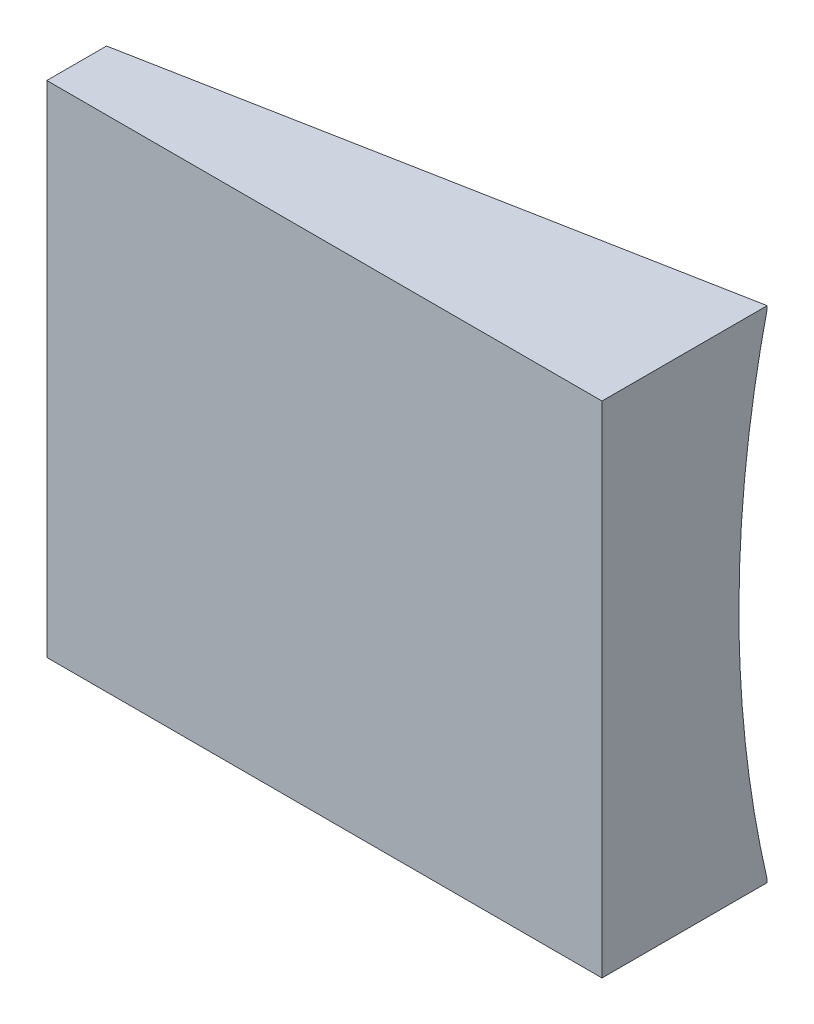
ISO-10303-21;
HEADER;
FILE_DESCRIPTION(('STEP AP214'),'2;1');
FILE_NAME('part.step','',(''),(''),'','','');
FILE_SCHEMA(('AUTOMOTIVE_DESIGN { 1 0 10303 214 1 1 1 1 }'));
ENDSEC;
DATA;
#1=APPLICATION_CONTEXT('core data for automotive mechanical design processes');
#2=APPLICATION_PROTOCOL_DEFINITION('international standard','automotive_design',2000,#1);
#3=PRODUCT_CONTEXT('',#1,'mechanical');
#4=PRODUCT('Part','Part','',(#3));
#5=PRODUCT_RELATED_PRODUCT_CATEGORY('part','',(#4));
#6=PRODUCT_DEFINITION_FORMATION('','',#4);
#7=PRODUCT_DEFINITION_CONTEXT('part definition',#1,'design');
#8=PRODUCT_DEFINITION('design','',#6,#7);
#9=PRODUCT_DEFINITION_SHAPE('','',#8);
#10=(LENGTH_UNIT() NAMED_UNIT(*) SI_UNIT(.MILLI.,.METRE.));
#11=(NAMED_UNIT(*) PLANE_ANGLE_UNIT() SI_UNIT($,.RADIAN.));
#12=(NAMED_UNIT(*) SI_UNIT($,.STERADIAN.) SOLID_ANGLE_UNIT());
#13=UNCERTAINTY_MEASURE_WITH_UNIT(LENGTH_MEASURE(1.E-05),#10,'distance_accuracy_value','');
#14=(GEOMETRIC_REPRESENTATION_CONTEXT(3) GLOBAL_UNCERTAINTY_ASSIGNED_CONTEXT((#13)) GLOBAL_UNIT_ASSIGNED_CONTEXT((#10,
#11,#12)) REPRESENTATION_CONTEXT('',''));
#15=CARTESIAN_POINT('',(0.,0.,0.));
#16=DIRECTION('',(0.,0.,1.));
#17=DIRECTION('',(1.,0.,0.));
#18=AXIS2_PLACEMENT_3D('',#15,#16,#17);
#19=CARTESIAN_POINT('',(20.0456309214071,68.9601218802256,0.0408989003201473));
#20=DIRECTION('',(0.186635756295296,0.,0.982429180385071));
#21=DIRECTION('',(0.982429180385071,0.,-0.186635756295296));
#22=AXIS2_PLACEMENT_3D('',#19,#20,#21);
#23=PLANE('',#22);
#24=DIRECTION('',(0.,1.,0.));
#25=VECTOR('',#24,1.);
#26=CARTESIAN_POINT('',(20.,-6.,0.0495675776124088));
#27=LINE('',#26,#25);
#28=CARTESIAN_POINT('',(20.,11.9,0.0495675776124097));
#29=VERTEX_POINT('',#28);
#30=CARTESIAN_POINT('',(20.,12.,0.0495675776124083));
#31=VERTEX_POINT('',#30);
#32=EDGE_CURVE('E99',#29,#31,#27,.T.);
#33=ORIENTED_EDGE('',*,*,#32,.F.);
#34=DIRECTION('',(-0.982429180385071,0.,0.186635756295296));
#35=VECTOR('',#34,1.);
#36=CARTESIAN_POINT('',(20.0456309214071,11.9,0.0408989003201482));
#37=LINE('',#36,#35);
#38=CARTESIAN_POINT('',(0.,11.9,3.84904259365668));
#39=VERTEX_POINT('',#38);
#40=EDGE_CURVE('E106',#29,#39,#37,.T.);
#41=ORIENTED_EDGE('',*,*,#40,.T.);
#42=DIRECTION('',(0.,-1.,0.));
#43=VECTOR('',#42,1.);
#44=CARTESIAN_POINT('',(0.,68.9601218802256,3.84904259365668));
#45=LINE('',#44,#43);
#46=CARTESIAN_POINT('',(0.,12.,3.84904259365668));
#47=VERTEX_POINT('',#46);
#48=EDGE_CURVE('E112',#47,#39,#45,.T.);
#49=ORIENTED_EDGE('',*,*,#48,.F.);
#50=DIRECTION('',(-0.982429180385071,0.,0.186635756295296));
#51=VECTOR('',#50,1.);
#52=CARTESIAN_POINT('',(-0.394391834731611,12.,3.92396668978641));
#53=LINE('',#52,#51);
#54=EDGE_CURVE('E109',#31,#47,#53,.T.);
#55=ORIENTED_EDGE('',*,*,#54,.F.);
#56=EDGE_LOOP('',(#33,#41,#49,#55));
#57=FACE_BOUND('',#56,.T.);
#58=ADVANCED_FACE('F33',(#57),#23,.F.);
#59=CARTESIAN_POINT('',(0.,-6.,6.));
#60=DIRECTION('',(1.,0.,0.));
#61=DIRECTION('',(0.,0.,-1.));
#62=AXIS2_PLACEMENT_3D('',#59,#60,#61);
#63=PLANE('',#62);
#64=ORIENTED_EDGE('',*,*,#48,.T.);
#65=CARTESIAN_POINT('',(0.,3.01180558268443,-35.8484753329929));
#66=DIRECTION('',(1.,0.,0.));
#67=DIRECTION('',(0.,0.,-1.));
#68=AXIS2_PLACEMENT_3D('',#65,#66,#67);
#69=ELLIPSE('',#68,40.7154030016919,40.);
#70=CARTESIAN_POINT('',(0.,3.01180558268443,4.86692766869898));
#71=VERTEX_POINT('',#70);
#72=EDGE_CURVE('E102',#39,#71,#69,.T.);
#73=ORIENTED_EDGE('',*,*,#72,.T.);
#74=DIRECTION('',(0.,1.,0.));
#75=VECTOR('',#74,1.);
#76=CARTESIAN_POINT('',(0.,-6.,4.86692766869898));
#77=LINE('',#76,#75);
#78=CARTESIAN_POINT('',(0.,2.98819441731563,4.86692766869898));
#79=VERTEX_POINT('',#78);
#80=EDGE_CURVE('E134',#79,#71,#77,.T.);
#81=ORIENTED_EDGE('',*,*,#80,.F.);
#82=CARTESIAN_POINT('',(0.,2.98819441731563,-35.8484753329929));
#83=DIRECTION('',(1.,0.,0.));
#84=DIRECTION('',(0.,0.,1.));
#85=AXIS2_PLACEMENT_3D('',#82,#83,#84);
#86=ELLIPSE('',#85,40.7154030016919,40.);
#87=CARTESIAN_POINT('',(0.,-5.89999999999996,3.84904259365668));
#88=VERTEX_POINT('',#87);
#89=EDGE_CURVE('E41',#79,#88,#86,.T.);
#90=ORIENTED_EDGE('',*,*,#89,.T.);
#91=CARTESIAN_POINT('',(0.,-5.99999999999996,3.84904259365668));
#92=VERTEX_POINT('',#91);
#93=EDGE_CURVE('E131',#88,#92,#45,.T.);
#94=ORIENTED_EDGE('',*,*,#93,.T.);
#95=DIRECTION('',(0.,0.,-1.));
#96=VECTOR('',#95,1.);
#97=CARTESIAN_POINT('',(0.,-6.,6.));
#98=LINE('',#97,#96);
#99=CARTESIAN_POINT('',(0.,-6.,6.));
#100=VERTEX_POINT('',#99);
#101=EDGE_CURVE('E119',#100,#92,#98,.T.);
#102=ORIENTED_EDGE('',*,*,#101,.F.);
#103=DIRECTION('',(0.,-1.,0.));
#104=VECTOR('',#103,1.);
#105=CARTESIAN_POINT('',(0.,-6.,6.));
#106=LINE('',#105,#104);
#107=CARTESIAN_POINT('',(0.,12.,6.));
#108=VERTEX_POINT('',#107);
#109=EDGE_CURVE('E149',#108,#100,#106,.T.);
#110=ORIENTED_EDGE('',*,*,#109,.F.);
#111=DIRECTION('',(0.,0.,-1.));
#112=VECTOR('',#111,1.);
#113=CARTESIAN_POINT('',(0.,12.,6.));
#114=LINE('',#113,#112);
#115=EDGE_CURVE('E158',#108,#47,#114,.T.);
#116=ORIENTED_EDGE('',*,*,#115,.T.);
#117=EDGE_LOOP('',(#64,#73,#81,#90,#94,#102,#110,#116));
#118=FACE_BOUND('',#117,.T.);
#119=ADVANCED_FACE('F129',(#118),#63,.F.);
#120=CARTESIAN_POINT('',(0.,-6.,6.));
#121=DIRECTION('',(0.,1.,0.));
#122=DIRECTION('',(0.,0.,1.));
#123=AXIS2_PLACEMENT_3D('',#120,#121,#122);
#124=PLANE('',#123);
#125=ORIENTED_EDGE('',*,*,#101,.T.);
#126=DIRECTION('',(0.982429180385071,0.,-0.186635756295296));
#127=VECTOR('',#126,1.);
#128=CARTESIAN_POINT('',(-0.394391834731611,-6.,3.92396668978641));
#129=LINE('',#128,#127);
#130=CARTESIAN_POINT('',(20.,-6.,0.0495675776124088));
#131=VERTEX_POINT('',#130);
#132=EDGE_CURVE('E142',#92,#131,#129,.T.);
#133=ORIENTED_EDGE('',*,*,#132,.T.);
#134=DIRECTION('',(0.,0.,-1.));
#135=VECTOR('',#134,1.);
#136=CARTESIAN_POINT('',(20.,-6.,6.));
#137=LINE('',#136,#135);
#138=CARTESIAN_POINT('',(20.,-6.,6.));
#139=VERTEX_POINT('',#138);
#140=EDGE_CURVE('E163',#139,#131,#137,.T.);
#141=ORIENTED_EDGE('',*,*,#140,.F.);
#142=DIRECTION('',(1.,0.,0.));
#143=VECTOR('',#142,1.);
#144=CARTESIAN_POINT('',(0.,-6.,6.));
#145=LINE('',#144,#143);
#146=EDGE_CURVE('E152',#100,#139,#145,.T.);
#147=ORIENTED_EDGE('',*,*,#146,.F.);
#148=EDGE_LOOP('',(#125,#133,#141,#147));
#149=FACE_BOUND('',#148,.T.);
#150=ADVANCED_FACE('F166',(#149),#124,.F.);
#151=CARTESIAN_POINT('',(20.,-6.,6.));
#152=DIRECTION('',(-1.,0.,0.));
#153=DIRECTION('',(0.,0.,1.));
#154=AXIS2_PLACEMENT_3D('',#151,#152,#153);
#155=PLANE('',#154);
#156=DIRECTION('',(0.,-1.,0.));
#157=VECTOR('',#156,1.);
#158=CARTESIAN_POINT('',(20.,-6.,1.06745265265471));
#159=LINE('',#158,#157);
#160=CARTESIAN_POINT('',(20.,3.01180558268443,1.06745265265471));
#161=VERTEX_POINT('',#160);
#162=CARTESIAN_POINT('',(20.,2.98819441731563,1.06745265265471));
#163=VERTEX_POINT('',#162);
#164=EDGE_CURVE('E101',#161,#163,#159,.T.);
#165=ORIENTED_EDGE('',*,*,#164,.F.);
#166=CARTESIAN_POINT('',(20.,3.01180558268443,-39.6479503490372));
#167=DIRECTION('',(-1.,0.,0.));
#168=DIRECTION('',(0.,0.,-1.));
#169=AXIS2_PLACEMENT_3D('',#166,#167,#168);
#170=ELLIPSE('',#169,40.7154030016919,40.);
#171=EDGE_CURVE('E54',#161,#29,#170,.T.);
#172=ORIENTED_EDGE('',*,*,#171,.T.);
#173=ORIENTED_EDGE('',*,*,#32,.T.);
#174=DIRECTION('',(0.,0.,-1.));
#175=VECTOR('',#174,1.);
#176=CARTESIAN_POINT('',(20.,12.,6.));
#177=LINE('',#176,#175);
#178=CARTESIAN_POINT('',(20.,12.,6.));
#179=VERTEX_POINT('',#178);
#180=EDGE_CURVE('E161',#179,#31,#177,.T.);
#181=ORIENTED_EDGE('',*,*,#180,.F.);
#182=DIRECTION('',(0.,1.,0.));
#183=VECTOR('',#182,1.);
#184=CARTESIAN_POINT('',(20.,-6.,6.));
#185=LINE('',#184,#183);
#186=EDGE_CURVE('E154',#139,#179,#185,.T.);
#187=ORIENTED_EDGE('',*,*,#186,.F.);
#188=ORIENTED_EDGE('',*,*,#140,.T.);
#189=CARTESIAN_POINT('',(20.,-5.89999999999996,0.0495675776124088));
#190=VERTEX_POINT('',#189);
#191=EDGE_CURVE('E111',#131,#190,#27,.T.);
#192=ORIENTED_EDGE('',*,*,#191,.T.);
#193=CARTESIAN_POINT('',(20.,2.98819441731563,-39.6479503490372));
#194=DIRECTION('',(-1.,0.,0.));
#195=DIRECTION('',(0.,0.,1.));
#196=AXIS2_PLACEMENT_3D('',#193,#194,#195);
#197=ELLIPSE('',#196,40.7154030016919,40.);
#198=EDGE_CURVE('E11',#190,#163,#197,.T.);
#199=ORIENTED_EDGE('',*,*,#198,.T.);
#200=EDGE_LOOP('',(#165,#172,#173,#181,#187,#188,#192,#199));
#201=FACE_BOUND('',#200,.T.);
#202=ADVANCED_FACE('F97',(#201),#155,.F.);
#203=CARTESIAN_POINT('',(0.,12.,6.));
#204=DIRECTION('',(0.,-1.,0.));
#205=DIRECTION('',(1.,0.,0.));
#206=AXIS2_PLACEMENT_3D('',#203,#204,#205);
#207=PLANE('',#206);
#208=ORIENTED_EDGE('',*,*,#180,.T.);
#209=ORIENTED_EDGE('',*,*,#54,.T.);
#210=ORIENTED_EDGE('',*,*,#115,.F.);
#211=DIRECTION('',(-1.,0.,0.));
#212=VECTOR('',#211,1.);
#213=CARTESIAN_POINT('',(0.,12.,6.));
#214=LINE('',#213,#212);
#215=EDGE_CURVE('E156',#179,#108,#214,.T.);
#216=ORIENTED_EDGE('',*,*,#215,.F.);
#217=EDGE_LOOP('',(#208,#209,#210,#216));
#218=FACE_BOUND('',#217,.T.);
#219=ADVANCED_FACE('F175',(#218),#207,.F.);
#220=CARTESIAN_POINT('',(0.,0.,6.));
#221=DIRECTION('',(0.,0.,-1.));
#222=DIRECTION('',(-1.,0.,0.));
#223=AXIS2_PLACEMENT_3D('',#220,#221,#222);
#224=PLANE('',#223);
#225=ORIENTED_EDGE('',*,*,#109,.T.);
#226=ORIENTED_EDGE('',*,*,#146,.T.);
#227=ORIENTED_EDGE('',*,*,#186,.T.);
#228=ORIENTED_EDGE('',*,*,#215,.T.);
#229=EDGE_LOOP('',(#225,#226,#227,#228));
#230=FACE_BOUND('',#229,.T.);
#231=ADVANCED_FACE('F171',(#230),#224,.F.);
#232=ORIENTED_EDGE('',*,*,#93,.F.);
#233=DIRECTION('',(-0.982429180385071,0.,0.186635756295296));
#234=VECTOR('',#233,1.);
#235=CARTESIAN_POINT('',(20.,-5.89999999999996,0.0495675776124105));
#236=LINE('',#235,#234);
#237=EDGE_CURVE('E140',#190,#88,#236,.T.);
#238=ORIENTED_EDGE('',*,*,#237,.F.);
#239=ORIENTED_EDGE('',*,*,#191,.F.);
#240=ORIENTED_EDGE('',*,*,#132,.F.);
#241=EDGE_LOOP('',(#232,#238,#239,#240));
#242=FACE_BOUND('',#241,.T.);
#243=ADVANCED_FACE('F139',(#242),#23,.F.);
#244=CARTESIAN_POINT('',(0.892382400090102,0.,4.69739843700398));
#245=DIRECTION('',(-0.186635756295296,0.,-0.982429180385071));
#246=DIRECTION('',(-0.982429180385071,0.,0.186635756295296));
#247=AXIS2_PLACEMENT_3D('',#244,#245,#246);
#248=PLANE('',#247);
#249=ORIENTED_EDGE('',*,*,#80,.T.);
#250=DIRECTION('',(-0.982429180385071,0.,0.186635756295296));
#251=VECTOR('',#250,1.);
#252=CARTESIAN_POINT('',(20.,3.01180558268443,1.06745265265471));
#253=LINE('',#252,#251);
#254=EDGE_CURVE('E103',#71,#161,#253,.F.);
#255=ORIENTED_EDGE('',*,*,#254,.T.);
#256=ORIENTED_EDGE('',*,*,#164,.T.);
#257=DIRECTION('',(0.982429180385071,0.,-0.186635756295296));
#258=VECTOR('',#257,1.);
#259=CARTESIAN_POINT('',(0.,2.98819441731563,4.86692766869898));
#260=LINE('',#259,#258);
#261=EDGE_CURVE('E117',#163,#79,#260,.F.);
#262=ORIENTED_EDGE('',*,*,#261,.T.);
#263=EDGE_LOOP('',(#249,#255,#256,#262));
#264=FACE_BOUND('',#263,.T.);
#265=ADVANCED_FACE('F192',(#264),#248,.T.);
#266=CARTESIAN_POINT('',(12.7212055044834,3.01180558268443,-38.2651704574054));
#267=DIRECTION('',(0.982429180385071,0.,-0.186635756295296));
#268=DIRECTION('',(-0.186635756295296,0.,-0.982429180385071));
#269=AXIS2_PLACEMENT_3D('',#266,#267,#268);
#270=CYLINDRICAL_SURFACE('',#269,40.);
#271=ORIENTED_EDGE('',*,*,#72,.F.);
#272=ORIENTED_EDGE('',*,*,#40,.F.);
#273=ORIENTED_EDGE('',*,*,#171,.F.);
#274=ORIENTED_EDGE('',*,*,#254,.F.);
#275=EDGE_LOOP('',(#271,#272,#273,#274));
#276=FACE_BOUND('',#275,.T.);
#277=ADVANCED_FACE('F115',(#276),#270,.F.);
#278=CARTESIAN_POINT('',(12.7212055044834,2.98819441731563,-38.2651704574054));
#279=DIRECTION('',(-0.982429180385071,0.,0.186635756295296));
#280=DIRECTION('',(0.186635756295296,0.,0.982429180385071));
#281=AXIS2_PLACEMENT_3D('',#278,#279,#280);
#282=CYLINDRICAL_SURFACE('',#281,40.);
#283=ORIENTED_EDGE('',*,*,#198,.F.);
#284=ORIENTED_EDGE('',*,*,#237,.T.);
#285=ORIENTED_EDGE('',*,*,#89,.F.);
#286=ORIENTED_EDGE('',*,*,#261,.F.);
#287=EDGE_LOOP('',(#283,#284,#285,#286));
#288=FACE_BOUND('',#287,.T.);
#289=ADVANCED_FACE('F35',(#288),#282,.F.);
#290=CLOSED_SHELL('',(#58,#119,#150,#202,#219,#231,#243,#265,#277,#289));
#291=MANIFOLD_SOLID_BREP('B2',#290);
#292=ADVANCED_BREP_SHAPE_REPRESENTATION('',(#18,#291),#14);
#293=SHAPE_DEFINITION_REPRESENTATION(#9,#292);
ENDSEC;
END-ISO-10303-21;
